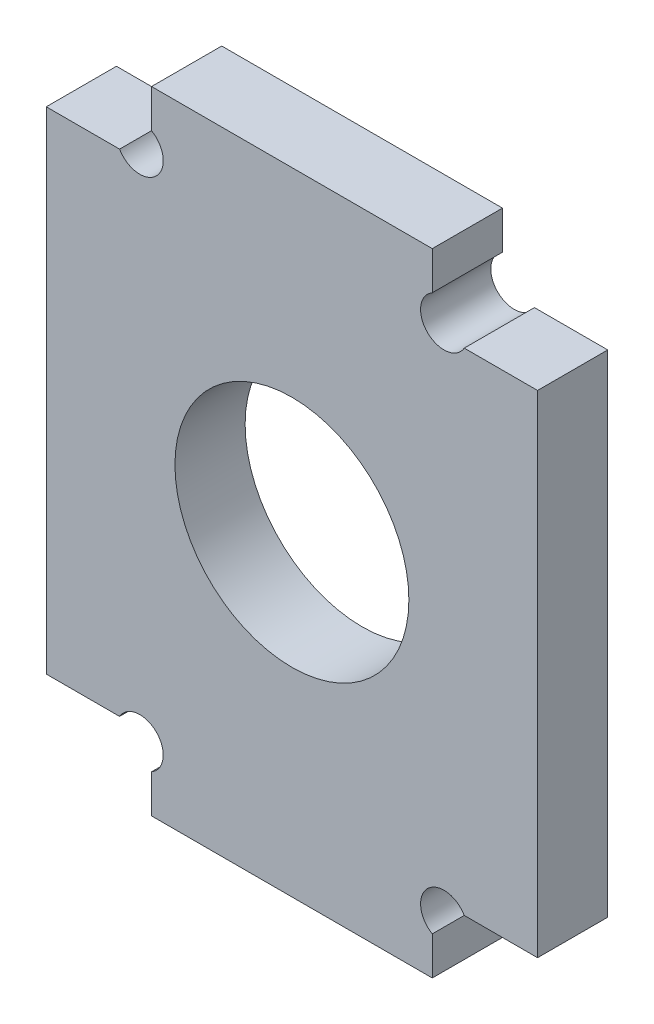
ISO-10303-21;
HEADER;
FILE_DESCRIPTION(('STEP AP214'),'2;1');
FILE_NAME('part.step','',(''),(''),'','','');
FILE_SCHEMA(('AUTOMOTIVE_DESIGN { 1 0 10303 214 1 1 1 1 }'));
ENDSEC;
DATA;
#1=APPLICATION_CONTEXT('core data for automotive mechanical design processes');
#2=APPLICATION_PROTOCOL_DEFINITION('international standard','automotive_design',2000,#1);
#3=PRODUCT_CONTEXT('',#1,'mechanical');
#4=PRODUCT('Part','Part','',(#3));
#5=PRODUCT_RELATED_PRODUCT_CATEGORY('part','',(#4));
#6=PRODUCT_DEFINITION_FORMATION('','',#4);
#7=PRODUCT_DEFINITION_CONTEXT('part definition',#1,'design');
#8=PRODUCT_DEFINITION('design','',#6,#7);
#9=PRODUCT_DEFINITION_SHAPE('','',#8);
#10=(LENGTH_UNIT() NAMED_UNIT(*) SI_UNIT(.MILLI.,.METRE.));
#11=(NAMED_UNIT(*) PLANE_ANGLE_UNIT() SI_UNIT($,.RADIAN.));
#12=(NAMED_UNIT(*) SI_UNIT($,.STERADIAN.) SOLID_ANGLE_UNIT());
#13=UNCERTAINTY_MEASURE_WITH_UNIT(LENGTH_MEASURE(1.E-05),#10,'distance_accuracy_value','');
#14=(GEOMETRIC_REPRESENTATION_CONTEXT(3) GLOBAL_UNCERTAINTY_ASSIGNED_CONTEXT((#13)) GLOBAL_UNIT_ASSIGNED_CONTEXT((#10,
#11,#12)) REPRESENTATION_CONTEXT('',''));
#15=CARTESIAN_POINT('',(0.,0.,0.));
#16=DIRECTION('',(0.,0.,1.));
#17=DIRECTION('',(1.,0.,0.));
#18=AXIS2_PLACEMENT_3D('',#15,#16,#17);
#19=CARTESIAN_POINT('',(-6.,0.,3.));
#20=DIRECTION('',(1.,0.,0.));
#21=DIRECTION('',(0.,0.,-1.));
#22=AXIS2_PLACEMENT_3D('',#19,#20,#21);
#23=PLANE('',#22);
#24=DIRECTION('',(0.,-1.,0.));
#25=VECTOR('',#24,1.);
#26=CARTESIAN_POINT('',(-6.,0.,0.));
#27=LINE('',#26,#25);
#28=CARTESIAN_POINT('',(-6.,13.5,0.));
#29=VERTEX_POINT('',#28);
#30=CARTESIAN_POINT('',(-6.,11.8660254037844,0.));
#31=VERTEX_POINT('',#30);
#32=EDGE_CURVE('E181',#29,#31,#27,.T.);
#33=ORIENTED_EDGE('',*,*,#32,.T.);
#34=DIRECTION('',(0.,0.,1.));
#35=VECTOR('',#34,1.);
#36=CARTESIAN_POINT('',(-6.,11.8660254037844,0.));
#37=LINE('',#36,#35);
#38=CARTESIAN_POINT('',(-6.,11.8660254037844,3.));
#39=VERTEX_POINT('',#38);
#40=EDGE_CURVE('E158',#31,#39,#37,.T.);
#41=ORIENTED_EDGE('',*,*,#40,.T.);
#42=DIRECTION('',(0.,-1.,0.));
#43=VECTOR('',#42,1.);
#44=CARTESIAN_POINT('',(-6.,0.,3.));
#45=LINE('',#44,#43);
#46=CARTESIAN_POINT('',(-6.,13.5,3.));
#47=VERTEX_POINT('',#46);
#48=EDGE_CURVE('E222',#47,#39,#45,.T.);
#49=ORIENTED_EDGE('',*,*,#48,.F.);
#50=DIRECTION('',(0.,0.,-1.));
#51=VECTOR('',#50,1.);
#52=CARTESIAN_POINT('',(-6.,13.5,3.));
#53=LINE('',#52,#51);
#54=EDGE_CURVE('E223',#47,#29,#53,.T.);
#55=ORIENTED_EDGE('',*,*,#54,.T.);
#56=EDGE_LOOP('',(#33,#41,#49,#55));
#57=FACE_BOUND('',#56,.T.);
#58=ADVANCED_FACE('F41',(#57),#23,.F.);
#59=CARTESIAN_POINT('',(0.,10.5,3.));
#60=DIRECTION('',(0.,1.,0.));
#61=DIRECTION('',(0.,0.,1.));
#62=AXIS2_PLACEMENT_3D('',#59,#60,#61);
#63=PLANE('',#62);
#64=DIRECTION('',(0.,0.,1.));
#65=VECTOR('',#64,1.);
#66=CARTESIAN_POINT('',(-7.36602540378444,10.5,0.));
#67=LINE('',#66,#65);
#68=CARTESIAN_POINT('',(-7.36602540378444,10.5,0.));
#69=VERTEX_POINT('',#68);
#70=CARTESIAN_POINT('',(-7.36602540378444,10.5,3.));
#71=VERTEX_POINT('',#70);
#72=EDGE_CURVE('E155',#69,#71,#67,.T.);
#73=ORIENTED_EDGE('',*,*,#72,.F.);
#74=DIRECTION('',(1.,0.,0.));
#75=VECTOR('',#74,1.);
#76=CARTESIAN_POINT('',(0.,10.5,0.));
#77=LINE('',#76,#75);
#78=CARTESIAN_POINT('',(-10.5,10.5,0.));
#79=VERTEX_POINT('',#78);
#80=EDGE_CURVE('E169',#79,#69,#77,.T.);
#81=ORIENTED_EDGE('',*,*,#80,.F.);
#82=DIRECTION('',(0.,0.,-1.));
#83=VECTOR('',#82,1.);
#84=CARTESIAN_POINT('',(-10.5,10.5,3.));
#85=LINE('',#84,#83);
#86=CARTESIAN_POINT('',(-10.5,10.5,3.));
#87=VERTEX_POINT('',#86);
#88=EDGE_CURVE('E164',#87,#79,#85,.T.);
#89=ORIENTED_EDGE('',*,*,#88,.F.);
#90=DIRECTION('',(1.,0.,0.));
#91=VECTOR('',#90,1.);
#92=CARTESIAN_POINT('',(0.,10.5,3.));
#93=LINE('',#92,#91);
#94=EDGE_CURVE('E171',#87,#71,#93,.T.);
#95=ORIENTED_EDGE('',*,*,#94,.T.);
#96=EDGE_LOOP('',(#73,#81,#89,#95));
#97=FACE_BOUND('',#96,.T.);
#98=ADVANCED_FACE('F168',(#97),#63,.T.);
#99=CARTESIAN_POINT('',(-10.5,0.,3.));
#100=DIRECTION('',(1.,0.,0.));
#101=DIRECTION('',(0.,0.,-1.));
#102=AXIS2_PLACEMENT_3D('',#99,#100,#101);
#103=PLANE('',#102);
#104=DIRECTION('',(0.,-1.,0.));
#105=VECTOR('',#104,1.);
#106=CARTESIAN_POINT('',(-10.5,0.,0.));
#107=LINE('',#106,#105);
#108=CARTESIAN_POINT('',(-10.5,-10.5,0.));
#109=VERTEX_POINT('',#108);
#110=EDGE_CURVE('E179',#79,#109,#107,.T.);
#111=ORIENTED_EDGE('',*,*,#110,.T.);
#112=DIRECTION('',(0.,0.,-1.));
#113=VECTOR('',#112,1.);
#114=CARTESIAN_POINT('',(-10.5,-10.5,3.));
#115=LINE('',#114,#113);
#116=CARTESIAN_POINT('',(-10.5,-10.5,3.));
#117=VERTEX_POINT('',#116);
#118=EDGE_CURVE('E246',#117,#109,#115,.T.);
#119=ORIENTED_EDGE('',*,*,#118,.F.);
#120=DIRECTION('',(0.,-1.,0.));
#121=VECTOR('',#120,1.);
#122=CARTESIAN_POINT('',(-10.5,0.,3.));
#123=LINE('',#122,#121);
#124=EDGE_CURVE('E255',#87,#117,#123,.T.);
#125=ORIENTED_EDGE('',*,*,#124,.F.);
#126=ORIENTED_EDGE('',*,*,#88,.T.);
#127=EDGE_LOOP('',(#111,#119,#125,#126));
#128=FACE_BOUND('',#127,.T.);
#129=ADVANCED_FACE('F253',(#128),#103,.F.);
#130=CARTESIAN_POINT('',(0.,-10.5,3.));
#131=DIRECTION('',(0.,1.,0.));
#132=DIRECTION('',(-1.,0.,0.));
#133=AXIS2_PLACEMENT_3D('',#130,#131,#132);
#134=PLANE('',#133);
#135=DIRECTION('',(1.,0.,0.));
#136=VECTOR('',#135,1.);
#137=CARTESIAN_POINT('',(0.,-10.5,0.));
#138=LINE('',#137,#136);
#139=CARTESIAN_POINT('',(-7.36602540378444,-10.5,0.));
#140=VERTEX_POINT('',#139);
#141=EDGE_CURVE('E185',#109,#140,#138,.T.);
#142=ORIENTED_EDGE('',*,*,#141,.T.);
#143=DIRECTION('',(0.,0.,1.));
#144=VECTOR('',#143,1.);
#145=CARTESIAN_POINT('',(-7.36602540378444,-10.5,0.));
#146=LINE('',#145,#144);
#147=CARTESIAN_POINT('',(-7.36602540378444,-10.5,3.));
#148=VERTEX_POINT('',#147);
#149=EDGE_CURVE('E56',#140,#148,#146,.T.);
#150=ORIENTED_EDGE('',*,*,#149,.T.);
#151=DIRECTION('',(1.,0.,0.));
#152=VECTOR('',#151,1.);
#153=CARTESIAN_POINT('',(0.,-10.5,3.));
#154=LINE('',#153,#152);
#155=EDGE_CURVE('E260',#117,#148,#154,.T.);
#156=ORIENTED_EDGE('',*,*,#155,.F.);
#157=ORIENTED_EDGE('',*,*,#118,.T.);
#158=EDGE_LOOP('',(#142,#150,#156,#157));
#159=FACE_BOUND('',#158,.T.);
#160=ADVANCED_FACE('F360',(#159),#134,.F.);
#161=CARTESIAN_POINT('',(-6.,0.,3.));
#162=DIRECTION('',(1.,0.,0.));
#163=DIRECTION('',(0.,0.,-1.));
#164=AXIS2_PLACEMENT_3D('',#161,#162,#163);
#165=PLANE('',#164);
#166=DIRECTION('',(0.,-1.,0.));
#167=VECTOR('',#166,1.);
#168=CARTESIAN_POINT('',(-6.,0.,3.));
#169=LINE('',#168,#167);
#170=CARTESIAN_POINT('',(-6.,-11.8660254037844,3.));
#171=VERTEX_POINT('',#170);
#172=CARTESIAN_POINT('',(-6.,-13.5,3.));
#173=VERTEX_POINT('',#172);
#174=EDGE_CURVE('E274',#171,#173,#169,.T.);
#175=ORIENTED_EDGE('',*,*,#174,.F.);
#176=DIRECTION('',(0.,0.,1.));
#177=VECTOR('',#176,1.);
#178=CARTESIAN_POINT('',(-6.,-11.8660254037844,0.));
#179=LINE('',#178,#177);
#180=CARTESIAN_POINT('',(-6.,-11.8660254037844,0.));
#181=VERTEX_POINT('',#180);
#182=EDGE_CURVE('E329',#171,#181,#179,.F.);
#183=ORIENTED_EDGE('',*,*,#182,.T.);
#184=DIRECTION('',(0.,-1.,0.));
#185=VECTOR('',#184,1.);
#186=CARTESIAN_POINT('',(-6.,0.,0.));
#187=LINE('',#186,#185);
#188=CARTESIAN_POINT('',(-6.,-13.5,0.));
#189=VERTEX_POINT('',#188);
#190=EDGE_CURVE('E194',#181,#189,#187,.T.);
#191=ORIENTED_EDGE('',*,*,#190,.T.);
#192=DIRECTION('',(0.,0.,-1.));
#193=VECTOR('',#192,1.);
#194=CARTESIAN_POINT('',(-6.,-13.5,3.));
#195=LINE('',#194,#193);
#196=EDGE_CURVE('E242',#173,#189,#195,.T.);
#197=ORIENTED_EDGE('',*,*,#196,.F.);
#198=EDGE_LOOP('',(#175,#183,#191,#197));
#199=FACE_BOUND('',#198,.T.);
#200=ADVANCED_FACE('F365',(#199),#165,.F.);
#201=CARTESIAN_POINT('',(0.,-13.5,3.));
#202=DIRECTION('',(0.,1.,0.));
#203=DIRECTION('',(0.,0.,1.));
#204=AXIS2_PLACEMENT_3D('',#201,#202,#203);
#205=PLANE('',#204);
#206=DIRECTION('',(1.,0.,0.));
#207=VECTOR('',#206,1.);
#208=CARTESIAN_POINT('',(0.,-13.5,0.));
#209=LINE('',#208,#207);
#210=CARTESIAN_POINT('',(6.,-13.5,0.));
#211=VERTEX_POINT('',#210);
#212=EDGE_CURVE('E197',#189,#211,#209,.T.);
#213=ORIENTED_EDGE('',*,*,#212,.T.);
#214=DIRECTION('',(0.,0.,-1.));
#215=VECTOR('',#214,1.);
#216=CARTESIAN_POINT('',(6.,-13.5,3.));
#217=LINE('',#216,#215);
#218=CARTESIAN_POINT('',(6.,-13.5,3.));
#219=VERTEX_POINT('',#218);
#220=EDGE_CURVE('E238',#219,#211,#217,.T.);
#221=ORIENTED_EDGE('',*,*,#220,.F.);
#222=DIRECTION('',(1.,0.,0.));
#223=VECTOR('',#222,1.);
#224=CARTESIAN_POINT('',(0.,-13.5,3.));
#225=LINE('',#224,#223);
#226=EDGE_CURVE('E277',#173,#219,#225,.T.);
#227=ORIENTED_EDGE('',*,*,#226,.F.);
#228=ORIENTED_EDGE('',*,*,#196,.T.);
#229=EDGE_LOOP('',(#213,#221,#227,#228));
#230=FACE_BOUND('',#229,.T.);
#231=ADVANCED_FACE('F369',(#230),#205,.F.);
#232=CARTESIAN_POINT('',(6.,0.,3.));
#233=DIRECTION('',(1.,0.,0.));
#234=DIRECTION('',(0.,0.,-1.));
#235=AXIS2_PLACEMENT_3D('',#232,#233,#234);
#236=PLANE('',#235);
#237=DIRECTION('',(0.,0.,1.));
#238=VECTOR('',#237,1.);
#239=CARTESIAN_POINT('',(6.,-11.8660254037844,0.));
#240=LINE('',#239,#238);
#241=CARTESIAN_POINT('',(6.,-11.8660254037844,3.));
#242=VERTEX_POINT('',#241);
#243=CARTESIAN_POINT('',(6.,-11.8660254037844,0.));
#244=VERTEX_POINT('',#243);
#245=EDGE_CURVE('E64',#242,#244,#240,.F.);
#246=ORIENTED_EDGE('',*,*,#245,.F.);
#247=DIRECTION('',(0.,-1.,0.));
#248=VECTOR('',#247,1.);
#249=CARTESIAN_POINT('',(6.,0.,3.));
#250=LINE('',#249,#248);
#251=EDGE_CURVE('E281',#242,#219,#250,.T.);
#252=ORIENTED_EDGE('',*,*,#251,.T.);
#253=ORIENTED_EDGE('',*,*,#220,.T.);
#254=DIRECTION('',(0.,-1.,0.));
#255=VECTOR('',#254,1.);
#256=CARTESIAN_POINT('',(6.,0.,0.));
#257=LINE('',#256,#255);
#258=EDGE_CURVE('E201',#244,#211,#257,.T.);
#259=ORIENTED_EDGE('',*,*,#258,.F.);
#260=EDGE_LOOP('',(#246,#252,#253,#259));
#261=FACE_BOUND('',#260,.T.);
#262=ADVANCED_FACE('F373',(#261),#236,.T.);
#263=CARTESIAN_POINT('',(0.,-10.5,3.));
#264=DIRECTION('',(0.,1.,0.));
#265=DIRECTION('',(-1.,0.,0.));
#266=AXIS2_PLACEMENT_3D('',#263,#264,#265);
#267=PLANE('',#266);
#268=DIRECTION('',(1.,0.,0.));
#269=VECTOR('',#268,1.);
#270=CARTESIAN_POINT('',(0.,-10.5,3.));
#271=LINE('',#270,#269);
#272=CARTESIAN_POINT('',(7.36602540378444,-10.5,3.));
#273=VERTEX_POINT('',#272);
#274=CARTESIAN_POINT('',(10.5,-10.5,3.));
#275=VERTEX_POINT('',#274);
#276=EDGE_CURVE('E284',#273,#275,#271,.T.);
#277=ORIENTED_EDGE('',*,*,#276,.F.);
#278=DIRECTION('',(0.,0.,1.));
#279=VECTOR('',#278,1.);
#280=CARTESIAN_POINT('',(7.36602540378444,-10.5,0.));
#281=LINE('',#280,#279);
#282=CARTESIAN_POINT('',(7.36602540378444,-10.5,0.));
#283=VERTEX_POINT('',#282);
#284=EDGE_CURVE('E323',#273,#283,#281,.F.);
#285=ORIENTED_EDGE('',*,*,#284,.T.);
#286=DIRECTION('',(1.,0.,0.));
#287=VECTOR('',#286,1.);
#288=CARTESIAN_POINT('',(0.,-10.5,0.));
#289=LINE('',#288,#287);
#290=CARTESIAN_POINT('',(10.5,-10.5,0.));
#291=VERTEX_POINT('',#290);
#292=EDGE_CURVE('E204',#283,#291,#289,.T.);
#293=ORIENTED_EDGE('',*,*,#292,.T.);
#294=DIRECTION('',(0.,0.,-1.));
#295=VECTOR('',#294,1.);
#296=CARTESIAN_POINT('',(10.5,-10.5,3.));
#297=LINE('',#296,#295);
#298=EDGE_CURVE('E234',#275,#291,#297,.T.);
#299=ORIENTED_EDGE('',*,*,#298,.F.);
#300=EDGE_LOOP('',(#277,#285,#293,#299));
#301=FACE_BOUND('',#300,.T.);
#302=ADVANCED_FACE('F377',(#301),#267,.F.);
#303=CARTESIAN_POINT('',(10.5,0.,3.));
#304=DIRECTION('',(1.,0.,0.));
#305=DIRECTION('',(0.,0.,-1.));
#306=AXIS2_PLACEMENT_3D('',#303,#304,#305);
#307=PLANE('',#306);
#308=DIRECTION('',(0.,-1.,0.));
#309=VECTOR('',#308,1.);
#310=CARTESIAN_POINT('',(10.5,0.,0.));
#311=LINE('',#310,#309);
#312=CARTESIAN_POINT('',(10.5,10.5,0.));
#313=VERTEX_POINT('',#312);
#314=EDGE_CURVE('E207',#313,#291,#311,.T.);
#315=ORIENTED_EDGE('',*,*,#314,.F.);
#316=DIRECTION('',(0.,0.,-1.));
#317=VECTOR('',#316,1.);
#318=CARTESIAN_POINT('',(10.5,10.5,3.));
#319=LINE('',#318,#317);
#320=CARTESIAN_POINT('',(10.5,10.5,3.));
#321=VERTEX_POINT('',#320);
#322=EDGE_CURVE('E230',#321,#313,#319,.T.);
#323=ORIENTED_EDGE('',*,*,#322,.F.);
#324=DIRECTION('',(0.,-1.,0.));
#325=VECTOR('',#324,1.);
#326=CARTESIAN_POINT('',(10.5,0.,3.));
#327=LINE('',#326,#325);
#328=EDGE_CURVE('E287',#321,#275,#327,.T.);
#329=ORIENTED_EDGE('',*,*,#328,.T.);
#330=ORIENTED_EDGE('',*,*,#298,.T.);
#331=EDGE_LOOP('',(#315,#323,#329,#330));
#332=FACE_BOUND('',#331,.T.);
#333=ADVANCED_FACE('F381',(#332),#307,.T.);
#334=CARTESIAN_POINT('',(0.,10.5,3.));
#335=DIRECTION('',(0.,1.,0.));
#336=DIRECTION('',(0.,0.,1.));
#337=AXIS2_PLACEMENT_3D('',#334,#335,#336);
#338=PLANE('',#337);
#339=DIRECTION('',(0.,0.,1.));
#340=VECTOR('',#339,1.);
#341=CARTESIAN_POINT('',(7.36602540378444,10.5,0.));
#342=LINE('',#341,#340);
#343=CARTESIAN_POINT('',(7.36602540378444,10.5,3.));
#344=VERTEX_POINT('',#343);
#345=CARTESIAN_POINT('',(7.36602540378444,10.5,0.));
#346=VERTEX_POINT('',#345);
#347=EDGE_CURVE('E317',#344,#346,#342,.F.);
#348=ORIENTED_EDGE('',*,*,#347,.F.);
#349=DIRECTION('',(1.,0.,0.));
#350=VECTOR('',#349,1.);
#351=CARTESIAN_POINT('',(0.,10.5,3.));
#352=LINE('',#351,#350);
#353=EDGE_CURVE('E291',#344,#321,#352,.T.);
#354=ORIENTED_EDGE('',*,*,#353,.T.);
#355=ORIENTED_EDGE('',*,*,#322,.T.);
#356=DIRECTION('',(1.,0.,0.));
#357=VECTOR('',#356,1.);
#358=CARTESIAN_POINT('',(0.,10.5,0.));
#359=LINE('',#358,#357);
#360=EDGE_CURVE('E211',#346,#313,#359,.T.);
#361=ORIENTED_EDGE('',*,*,#360,.F.);
#362=EDGE_LOOP('',(#348,#354,#355,#361));
#363=FACE_BOUND('',#362,.T.);
#364=ADVANCED_FACE('F385',(#363),#338,.T.);
#365=CARTESIAN_POINT('',(6.,0.,3.));
#366=DIRECTION('',(1.,0.,0.));
#367=DIRECTION('',(0.,0.,-1.));
#368=AXIS2_PLACEMENT_3D('',#365,#366,#367);
#369=PLANE('',#368);
#370=DIRECTION('',(0.,0.,1.));
#371=VECTOR('',#370,1.);
#372=CARTESIAN_POINT('',(6.,11.8660254037844,0.));
#373=LINE('',#372,#371);
#374=CARTESIAN_POINT('',(6.,11.8660254037844,0.));
#375=VERTEX_POINT('',#374);
#376=CARTESIAN_POINT('',(6.,11.8660254037844,3.));
#377=VERTEX_POINT('',#376);
#378=EDGE_CURVE('E312',#375,#377,#373,.T.);
#379=ORIENTED_EDGE('',*,*,#378,.F.);
#380=DIRECTION('',(0.,-1.,0.));
#381=VECTOR('',#380,1.);
#382=CARTESIAN_POINT('',(6.,0.,0.));
#383=LINE('',#382,#381);
#384=CARTESIAN_POINT('',(6.,13.5,0.));
#385=VERTEX_POINT('',#384);
#386=EDGE_CURVE('E214',#385,#375,#383,.T.);
#387=ORIENTED_EDGE('',*,*,#386,.F.);
#388=DIRECTION('',(0.,0.,-1.));
#389=VECTOR('',#388,1.);
#390=CARTESIAN_POINT('',(6.,13.5,3.));
#391=LINE('',#390,#389);
#392=CARTESIAN_POINT('',(6.,13.5,3.));
#393=VERTEX_POINT('',#392);
#394=EDGE_CURVE('E226',#393,#385,#391,.T.);
#395=ORIENTED_EDGE('',*,*,#394,.F.);
#396=DIRECTION('',(0.,-1.,0.));
#397=VECTOR('',#396,1.);
#398=CARTESIAN_POINT('',(6.,0.,3.));
#399=LINE('',#398,#397);
#400=EDGE_CURVE('E294',#393,#377,#399,.T.);
#401=ORIENTED_EDGE('',*,*,#400,.T.);
#402=EDGE_LOOP('',(#379,#387,#395,#401));
#403=FACE_BOUND('',#402,.T.);
#404=ADVANCED_FACE('F311',(#403),#369,.T.);
#405=CARTESIAN_POINT('',(0.,13.5,3.));
#406=DIRECTION('',(0.,1.,0.));
#407=DIRECTION('',(0.,0.,1.));
#408=AXIS2_PLACEMENT_3D('',#405,#406,#407);
#409=PLANE('',#408);
#410=DIRECTION('',(1.,0.,0.));
#411=VECTOR('',#410,1.);
#412=CARTESIAN_POINT('',(0.,13.5,0.));
#413=LINE('',#412,#411);
#414=EDGE_CURVE('E218',#29,#385,#413,.T.);
#415=ORIENTED_EDGE('',*,*,#414,.F.);
#416=ORIENTED_EDGE('',*,*,#54,.F.);
#417=DIRECTION('',(1.,0.,0.));
#418=VECTOR('',#417,1.);
#419=CARTESIAN_POINT('',(0.,13.5,3.));
#420=LINE('',#419,#418);
#421=EDGE_CURVE('E227',#47,#393,#420,.T.);
#422=ORIENTED_EDGE('',*,*,#421,.T.);
#423=ORIENTED_EDGE('',*,*,#394,.T.);
#424=EDGE_LOOP('',(#415,#416,#422,#423));
#425=FACE_BOUND('',#424,.T.);
#426=ADVANCED_FACE('F302',(#425),#409,.T.);
#427=CARTESIAN_POINT('',(0.,0.,3.));
#428=DIRECTION('',(0.,0.,1.));
#429=DIRECTION('',(1.,0.,0.));
#430=AXIS2_PLACEMENT_3D('',#427,#428,#429);
#431=PLANE('',#430);
#432=CARTESIAN_POINT('',(-6.5,-11.,3.));
#433=DIRECTION('',(0.,0.,1.));
#434=DIRECTION('',(-1.,0.,0.));
#435=AXIS2_PLACEMENT_3D('',#432,#433,#434);
#436=CIRCLE('',#435,1.);
#437=EDGE_CURVE('E510',#171,#148,#436,.T.);
#438=ORIENTED_EDGE('',*,*,#437,.F.);
#439=ORIENTED_EDGE('',*,*,#174,.T.);
#440=ORIENTED_EDGE('',*,*,#226,.T.);
#441=ORIENTED_EDGE('',*,*,#251,.F.);
#442=CARTESIAN_POINT('',(6.5,-11.,3.));
#443=DIRECTION('',(0.,0.,1.));
#444=DIRECTION('',(1.,0.,0.));
#445=AXIS2_PLACEMENT_3D('',#442,#443,#444);
#446=CIRCLE('',#445,1.);
#447=EDGE_CURVE('E509',#273,#242,#446,.T.);
#448=ORIENTED_EDGE('',*,*,#447,.F.);
#449=ORIENTED_EDGE('',*,*,#276,.T.);
#450=ORIENTED_EDGE('',*,*,#328,.F.);
#451=ORIENTED_EDGE('',*,*,#353,.F.);
#452=CARTESIAN_POINT('',(6.5,11.,3.));
#453=DIRECTION('',(0.,0.,1.));
#454=DIRECTION('',(-1.,0.,0.));
#455=AXIS2_PLACEMENT_3D('',#452,#453,#454);
#456=CIRCLE('',#455,1.);
#457=EDGE_CURVE('E308',#377,#344,#456,.T.);
#458=ORIENTED_EDGE('',*,*,#457,.F.);
#459=ORIENTED_EDGE('',*,*,#400,.F.);
#460=ORIENTED_EDGE('',*,*,#421,.F.);
#461=ORIENTED_EDGE('',*,*,#48,.T.);
#462=CARTESIAN_POINT('',(-6.5,11.,3.));
#463=DIRECTION('',(0.,0.,1.));
#464=DIRECTION('',(1.,0.,0.));
#465=AXIS2_PLACEMENT_3D('',#462,#463,#464);
#466=CIRCLE('',#465,1.);
#467=EDGE_CURVE('E173',#71,#39,#466,.T.);
#468=ORIENTED_EDGE('',*,*,#467,.F.);
#469=ORIENTED_EDGE('',*,*,#94,.F.);
#470=ORIENTED_EDGE('',*,*,#124,.T.);
#471=ORIENTED_EDGE('',*,*,#155,.T.);
#472=EDGE_LOOP('',(#438,#439,#440,#441,#448,#449,#450,#451,#458,#459,#460,#461,#468,#469,#470,#471));
#473=FACE_BOUND('',#472,.T.);
#474=CARTESIAN_POINT('',(0.,0.,3.));
#475=DIRECTION('',(0.,0.,1.));
#476=DIRECTION('',(1.,0.,0.));
#477=AXIS2_PLACEMENT_3D('',#474,#475,#476);
#478=CIRCLE('',#477,5.);
#479=CARTESIAN_POINT('',(5.,0.,3.));
#480=VERTEX_POINT('',#479);
#481=EDGE_CURVE('E335',#480,#480,#478,.T.);
#482=ORIENTED_EDGE('',*,*,#481,.F.);
#483=EDGE_LOOP('',(#482));
#484=FACE_BOUND('',#483,.T.);
#485=ADVANCED_FACE('F263',(#473,#484),#431,.T.);
#486=CARTESIAN_POINT('',(0.,0.,0.));
#487=DIRECTION('',(0.,0.,1.));
#488=DIRECTION('',(1.,0.,0.));
#489=AXIS2_PLACEMENT_3D('',#486,#487,#488);
#490=PLANE('',#489);
#491=CARTESIAN_POINT('',(0.,0.,0.));
#492=DIRECTION('',(0.,0.,1.));
#493=DIRECTION('',(1.,0.,0.));
#494=AXIS2_PLACEMENT_3D('',#491,#492,#493);
#495=CIRCLE('',#494,5.);
#496=CARTESIAN_POINT('',(5.,0.,0.));
#497=VERTEX_POINT('',#496);
#498=EDGE_CURVE('E187',#497,#497,#495,.T.);
#499=ORIENTED_EDGE('',*,*,#498,.T.);
#500=EDGE_LOOP('',(#499));
#501=FACE_BOUND('',#500,.T.);
#502=ORIENTED_EDGE('',*,*,#190,.F.);
#503=CARTESIAN_POINT('',(-6.5,-11.,0.));
#504=DIRECTION('',(0.,0.,1.));
#505=DIRECTION('',(-1.,0.,0.));
#506=AXIS2_PLACEMENT_3D('',#503,#504,#505);
#507=CIRCLE('',#506,1.);
#508=EDGE_CURVE('E507',#181,#140,#507,.T.);
#509=ORIENTED_EDGE('',*,*,#508,.T.);
#510=ORIENTED_EDGE('',*,*,#141,.F.);
#511=ORIENTED_EDGE('',*,*,#110,.F.);
#512=ORIENTED_EDGE('',*,*,#80,.T.);
#513=CARTESIAN_POINT('',(-6.5,11.,0.));
#514=DIRECTION('',(0.,0.,1.));
#515=DIRECTION('',(1.,0.,0.));
#516=AXIS2_PLACEMENT_3D('',#513,#514,#515);
#517=CIRCLE('',#516,1.);
#518=EDGE_CURVE('E49',#69,#31,#517,.T.);
#519=ORIENTED_EDGE('',*,*,#518,.T.);
#520=ORIENTED_EDGE('',*,*,#32,.F.);
#521=ORIENTED_EDGE('',*,*,#414,.T.);
#522=ORIENTED_EDGE('',*,*,#386,.T.);
#523=CARTESIAN_POINT('',(6.5,11.,0.));
#524=DIRECTION('',(0.,0.,1.));
#525=DIRECTION('',(1.,0.,0.));
#526=AXIS2_PLACEMENT_3D('',#523,#524,#525);
#527=CIRCLE('',#526,1.);
#528=EDGE_CURVE('E11',#375,#346,#527,.T.);
#529=ORIENTED_EDGE('',*,*,#528,.T.);
#530=ORIENTED_EDGE('',*,*,#360,.T.);
#531=ORIENTED_EDGE('',*,*,#314,.T.);
#532=ORIENTED_EDGE('',*,*,#292,.F.);
#533=CARTESIAN_POINT('',(6.5,-11.,0.));
#534=DIRECTION('',(0.,0.,1.));
#535=DIRECTION('',(1.,0.,0.));
#536=AXIS2_PLACEMENT_3D('',#533,#534,#535);
#537=CIRCLE('',#536,1.);
#538=EDGE_CURVE('E525',#283,#244,#537,.T.);
#539=ORIENTED_EDGE('',*,*,#538,.T.);
#540=ORIENTED_EDGE('',*,*,#258,.T.);
#541=ORIENTED_EDGE('',*,*,#212,.F.);
#542=EDGE_LOOP('',(#502,#509,#510,#511,#512,#519,#520,#521,#522,#529,#530,#531,#532,#539,#540,#541));
#543=FACE_BOUND('',#542,.T.);
#544=ADVANCED_FACE('F177',(#501,#543),#490,.F.);
#545=CARTESIAN_POINT('',(0.,0.,0.));
#546=DIRECTION('',(0.,0.,1.));
#547=DIRECTION('',(1.,0.,0.));
#548=AXIS2_PLACEMENT_3D('',#545,#546,#547);
#549=CYLINDRICAL_SURFACE('',#548,5.);
#550=ORIENTED_EDGE('',*,*,#498,.F.);
#551=EDGE_LOOP('',(#550));
#552=FACE_BOUND('',#551,.T.);
#553=ORIENTED_EDGE('',*,*,#481,.T.);
#554=EDGE_LOOP('',(#553));
#555=FACE_BOUND('',#554,.T.);
#556=ADVANCED_FACE('F342',(#552,#555),#549,.F.);
#557=CARTESIAN_POINT('',(-6.5,11.,0.));
#558=DIRECTION('',(0.,0.,1.));
#559=DIRECTION('',(1.,0.,0.));
#560=AXIS2_PLACEMENT_3D('',#557,#558,#559);
#561=CYLINDRICAL_SURFACE('',#560,1.);
#562=ORIENTED_EDGE('',*,*,#518,.F.);
#563=ORIENTED_EDGE('',*,*,#72,.T.);
#564=ORIENTED_EDGE('',*,*,#467,.T.);
#565=ORIENTED_EDGE('',*,*,#40,.F.);
#566=EDGE_LOOP('',(#562,#563,#564,#565));
#567=FACE_BOUND('',#566,.T.);
#568=ADVANCED_FACE('F154',(#567),#561,.F.);
#569=CARTESIAN_POINT('',(6.5,11.,0.));
#570=DIRECTION('',(0.,0.,1.));
#571=DIRECTION('',(1.,0.,0.));
#572=AXIS2_PLACEMENT_3D('',#569,#570,#571);
#573=CYLINDRICAL_SURFACE('',#572,1.);
#574=ORIENTED_EDGE('',*,*,#347,.T.);
#575=ORIENTED_EDGE('',*,*,#528,.F.);
#576=ORIENTED_EDGE('',*,*,#378,.T.);
#577=ORIENTED_EDGE('',*,*,#457,.T.);
#578=EDGE_LOOP('',(#574,#575,#576,#577));
#579=FACE_BOUND('',#578,.T.);
#580=ADVANCED_FACE('F476',(#579),#573,.F.);
#581=CARTESIAN_POINT('',(6.5,-11.,0.));
#582=DIRECTION('',(0.,0.,1.));
#583=DIRECTION('',(1.,0.,0.));
#584=AXIS2_PLACEMENT_3D('',#581,#582,#583);
#585=CYLINDRICAL_SURFACE('',#584,1.);
#586=ORIENTED_EDGE('',*,*,#245,.T.);
#587=ORIENTED_EDGE('',*,*,#538,.F.);
#588=ORIENTED_EDGE('',*,*,#284,.F.);
#589=ORIENTED_EDGE('',*,*,#447,.T.);
#590=EDGE_LOOP('',(#586,#587,#588,#589));
#591=FACE_BOUND('',#590,.T.);
#592=ADVANCED_FACE('F482',(#591),#585,.F.);
#593=CARTESIAN_POINT('',(-6.5,-11.,0.));
#594=DIRECTION('',(0.,0.,1.));
#595=DIRECTION('',(1.,0.,0.));
#596=AXIS2_PLACEMENT_3D('',#593,#594,#595);
#597=CYLINDRICAL_SURFACE('',#596,1.);
#598=ORIENTED_EDGE('',*,*,#508,.F.);
#599=ORIENTED_EDGE('',*,*,#182,.F.);
#600=ORIENTED_EDGE('',*,*,#437,.T.);
#601=ORIENTED_EDGE('',*,*,#149,.F.);
#602=EDGE_LOOP('',(#598,#599,#600,#601));
#603=FACE_BOUND('',#602,.T.);
#604=ADVANCED_FACE('F490',(#603),#597,.F.);
#605=CLOSED_SHELL('',(#58,#98,#129,#160,#200,#231,#262,#302,#333,#364,#404,#426,#485,#544,#556,
#568,#580,#592,#604));
#606=MANIFOLD_SOLID_BREP('B2',#605);
#607=ADVANCED_BREP_SHAPE_REPRESENTATION('',(#18,#606),#14);
#608=SHAPE_DEFINITION_REPRESENTATION(#9,#607);
ENDSEC;
END-ISO-10303-21;
